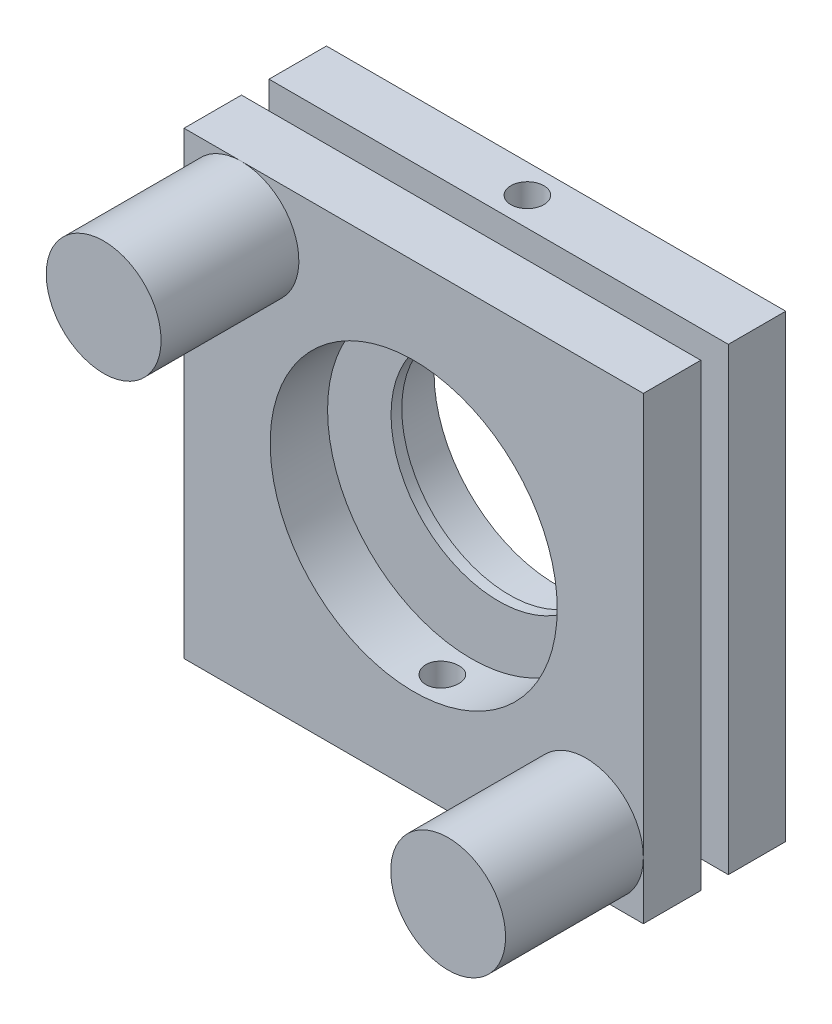
ISO-10303-21;
HEADER;
FILE_DESCRIPTION(('STEP AP214'),'2;1');
FILE_NAME('part.step','',(''),(''),'','','');
FILE_SCHEMA(('AUTOMOTIVE_DESIGN { 1 0 10303 214 1 1 1 1 }'));
ENDSEC;
DATA;
#1=APPLICATION_CONTEXT('core data for automotive mechanical design processes');
#2=APPLICATION_PROTOCOL_DEFINITION('international standard','automotive_design',2000,#1);
#3=PRODUCT_CONTEXT('',#1,'mechanical');
#4=PRODUCT('Part','Part','',(#3));
#5=PRODUCT_RELATED_PRODUCT_CATEGORY('part','',(#4));
#6=PRODUCT_DEFINITION_FORMATION('','',#4);
#7=PRODUCT_DEFINITION_CONTEXT('part definition',#1,'design');
#8=PRODUCT_DEFINITION('design','',#6,#7);
#9=PRODUCT_DEFINITION_SHAPE('','',#8);
#10=(LENGTH_UNIT() NAMED_UNIT(*) SI_UNIT(.MILLI.,.METRE.));
#11=(NAMED_UNIT(*) PLANE_ANGLE_UNIT() SI_UNIT($,.RADIAN.));
#12=(NAMED_UNIT(*) SI_UNIT($,.STERADIAN.) SOLID_ANGLE_UNIT());
#13=UNCERTAINTY_MEASURE_WITH_UNIT(LENGTH_MEASURE(1.E-05),#10,'distance_accuracy_value','');
#14=(GEOMETRIC_REPRESENTATION_CONTEXT(3) GLOBAL_UNCERTAINTY_ASSIGNED_CONTEXT((#13)) GLOBAL_UNIT_ASSIGNED_CONTEXT((#10,
#11,#12)) REPRESENTATION_CONTEXT('',''));
#15=CARTESIAN_POINT('',(0.,0.,0.));
#16=DIRECTION('',(0.,0.,1.));
#17=DIRECTION('',(1.,0.,0.));
#18=AXIS2_PLACEMENT_3D('',#15,#16,#17);
#19=CARTESIAN_POINT('',(0.,0.,6.35));
#20=DIRECTION('',(0.,0.,-1.));
#21=DIRECTION('',(-1.,0.,0.));
#22=AXIS2_PLACEMENT_3D('',#19,#20,#21);
#23=CYLINDRICAL_SURFACE('',#22,13.49375);
#24=CARTESIAN_POINT('',(0.,13.49375,4.99999));
#25=CARTESIAN_POINT('',(-0.102011065507764,13.4937484846847,4.99998571218308));
#26=CARTESIAN_POINT('',(-0.204084113140182,13.4925810328227,4.99140801103553));
#27=CARTESIAN_POINT('',(-0.405384911573508,13.4880361545994,4.95732809212892));
#28=CARTESIAN_POINT('',(-0.504609662072834,13.484656481134,4.93180866512879));
#29=CARTESIAN_POINT('',(-0.697270876109854,13.4760675340568,4.86461515998974));
#30=CARTESIAN_POINT('',(-0.790711368965015,13.4708595513084,4.82295247752227));
#31=CARTESIAN_POINT('',(-0.96925816473315,13.4591917573516,4.72468121637832));
#32=CARTESIAN_POINT('',(-1.05436578800917,13.4527321449517,4.66807501080982));
#33=CARTESIAN_POINT('',(-1.21439232934226,13.4392349304838,4.54113658284531));
#34=CARTESIAN_POINT('',(-1.28925017404579,13.4321942332398,4.47072768871401));
#35=CARTESIAN_POINT('',(-1.42612584943936,13.4183530481804,4.31834735144996));
#36=CARTESIAN_POINT('',(-1.48814299433216,13.4115525732108,4.2363752911435));
#37=CARTESIAN_POINT('',(-1.59780850199699,13.3989315654814,4.06279312652254));
#38=CARTESIAN_POINT('',(-1.64539888738692,13.3931150272035,3.97114607781443));
#39=CARTESIAN_POINT('',(-1.72448961367921,13.3831619312084,3.78106841750666));
#40=CARTESIAN_POINT('',(-1.75599066732376,13.3790252990747,3.68263810661838));
#41=CARTESIAN_POINT('',(-1.80182127116027,13.3729303380833,3.48242545379069));
#42=CARTESIAN_POINT('',(-1.81625455226167,13.370958855613,3.38066726439299));
#43=CARTESIAN_POINT('',(-1.82786102760656,13.3693773037304,3.17615546416737));
#44=CARTESIAN_POINT('',(-1.82503503070175,13.3697671236563,3.07340190021275));
#45=CARTESIAN_POINT('',(-1.80228817044596,13.3728520955904,2.87054286542589));
#46=CARTESIAN_POINT('',(-1.78248205901727,13.3755317723102,2.77042425834251));
#47=CARTESIAN_POINT('',(-1.72651646329715,13.3828703779794,2.5749447791491));
#48=CARTESIAN_POINT('',(-1.69035659628326,13.3875293532497,2.47958401844363));
#49=CARTESIAN_POINT('',(-1.60258815180315,13.3983189829991,2.29597354170509));
#50=CARTESIAN_POINT('',(-1.5509301991783,13.4044543284747,2.20774771463016));
#51=CARTESIAN_POINT('',(-1.43366722125478,13.4175018733881,2.04117345808384));
#52=CARTESIAN_POINT('',(-1.36806144995115,13.4244141143691,1.96282555729471));
#53=CARTESIAN_POINT('',(-1.2241315365846,13.4383052548934,1.81756548576252));
#54=CARTESIAN_POINT('',(-1.14570857974915,13.4452842404681,1.75075119425005));
#55=CARTESIAN_POINT('',(-0.978709321728446,13.4584702342152,1.63121872162295));
#56=CARTESIAN_POINT('',(-0.890132989801093,13.4646772400501,1.57850058318986));
#57=CARTESIAN_POINT('',(-0.705262224236707,13.475624732159,1.48865490134986));
#58=CARTESIAN_POINT('',(-0.608964504311511,13.4803645897862,1.45153403866925));
#59=CARTESIAN_POINT('',(-0.411424068830881,13.4878382315402,1.39401719435643));
#60=CARTESIAN_POINT('',(-0.310181624900939,13.4905721257274,1.37362029512942));
#61=CARTESIAN_POINT('',(-0.106471348205664,13.4937113965345,1.35025850740771));
#62=CARTESIAN_POINT('',(-0.00401923285335998,13.49413476909,1.34715889145906));
#63=CARTESIAN_POINT('',(0.199943102233538,13.4926540374248,1.35812330906334));
#64=CARTESIAN_POINT('',(0.301453345475255,13.4907499914498,1.37218691309155));
#65=CARTESIAN_POINT('',(0.500248793521115,13.4848395299594,1.41696658219215));
#66=CARTESIAN_POINT('',(0.597548855277587,13.4808412953621,1.44761786310707));
#67=CARTESIAN_POINT('',(0.785628222473928,13.4711897491495,1.52463508122611));
#68=CARTESIAN_POINT('',(0.876407272517,13.4655363727542,1.57100163351589));
#69=CARTESIAN_POINT('',(1.04946584897577,13.4531591632773,1.67845533484081));
#70=CARTESIAN_POINT('',(1.1316912169174,13.446429122137,1.73962898060639));
#71=CARTESIAN_POINT('',(1.28475602893671,13.4326694297858,1.87483876615841));
#72=CARTESIAN_POINT('',(1.35559494020665,13.425639764574,1.94887550751198));
#73=CARTESIAN_POINT('',(1.48435876334851,13.4120169803227,2.10830583010283));
#74=CARTESIAN_POINT('',(1.5421939680749,13.405427101834,2.19377218119314));
#75=CARTESIAN_POINT('',(1.64268744308819,13.3934849405941,2.37328519570781));
#76=CARTESIAN_POINT('',(1.68534606035804,13.3881326295493,2.46733166290284));
#77=CARTESIAN_POINT('',(1.75413259612252,13.3792942692336,2.66105437573903));
#78=CARTESIAN_POINT('',(1.78030977904879,13.3758026630075,2.76071286421206));
#79=CARTESIAN_POINT('',(1.81554834912333,13.3710655759946,2.96306167910378));
#80=CARTESIAN_POINT('',(1.82461068045636,13.3698199713016,3.06575183795512));
#81=CARTESIAN_POINT('',(1.82534297587301,13.3697199382207,3.27035594220333));
#82=CARTESIAN_POINT('',(1.8171539083415,13.3708461288808,3.37226940202946));
#83=CARTESIAN_POINT('',(1.78391576732261,13.3753209508971,3.57325657676135));
#84=CARTESIAN_POINT('',(1.75886670221735,13.3786695811484,3.67233029307888));
#85=CARTESIAN_POINT('',(1.69266598510481,13.3872056776009,3.86479906401303));
#86=CARTESIAN_POINT('',(1.65152232627812,13.3923922309002,3.95819691091883));
#87=CARTESIAN_POINT('',(1.55431419904779,13.4040211193476,4.13678623321956));
#88=CARTESIAN_POINT('',(1.49824941859329,13.4104634807581,4.2219775369373));
#89=CARTESIAN_POINT('',(1.37227154711501,13.4239410347823,4.38245454663529));
#90=CARTESIAN_POINT('',(1.30225360339792,13.4309804688922,4.45765759210414));
#91=CARTESIAN_POINT('',(1.1505774674404,13.4448223280904,4.59529888892537));
#92=CARTESIAN_POINT('',(1.06891655144899,13.4516246972552,4.65773414504438));
#93=CARTESIAN_POINT('',(0.895851056310109,13.4642599174439,4.76830917136205));
#94=CARTESIAN_POINT('',(0.804404773573208,13.47008832382,4.81638415388145));
#95=CARTESIAN_POINT('',(0.61470549441652,13.4800746140666,4.89642420871696));
#96=CARTESIAN_POINT('',(0.516459888431812,13.4842342793282,4.92840646943554));
#97=CARTESIAN_POINT('',(0.348109339331014,13.4894321908733,4.96785187211876));
#98=CARTESIAN_POINT('',(0.279057854872004,13.491043316646,4.97988592932566));
#99=CARTESIAN_POINT('',(0.140013975697671,13.4932027363939,4.99595642814456));
#100=CARTESIAN_POINT('',(0.0700215896297378,13.4937510401301,4.99999294320773));
#101=CARTESIAN_POINT('',(0.,13.49375,4.99999));
#102=B_SPLINE_CURVE_WITH_KNOTS('',3,(#24,#25,#26,#27,#28,#29,#30,#31,#32,#33,#34,#35,#36,#37,
#38,#39,#40,#41,#42,#43,#44,#45,#46,#47,#48,#49,#50,#51,#52,#53,#54,#55,#56,#57,#58,#59,#60,#61,
#62,#63,#64,#65,#66,#67,#68,#69,#70,#71,#72,#73,#74,#75,#76,#77,#78,#79,#80,#81,#82,#83,#84,#85,
#86,#87,#88,#89,#90,#91,#92,#93,#94,#95,#96,#97,#98,#99,#100,#101),.UNSPECIFIED.,.T.,.F.,(4,2,2,
2,2,2,2,2,2,2,2,2,2,2,2,2,2,2,2,2,2,2,2,2,2,2,2,2,2,2,2,2,2,2,2,2,2,2,4),(0.,0.305777392014365,
0.611865865971447,0.917738661768646,1.22356291258956,1.53113673496319,1.83872698003231,
2.14753744500254,2.45633422877429,2.76324446610899,3.07014032028347,3.37497836978815,
3.67982355370333,3.98565044391131,4.29149369551661,4.59981691115257,4.90814106034543,
5.21659713864297,5.52503629172792,5.8310696425318,6.13709533473841,6.44193436132278,
6.74678532048974,7.05346199240147,7.3601530104937,7.6688989334211,7.97763779702386,
8.28544937669571,8.59324397465485,8.89853321415223,9.20382230187207,9.50895996364861,
9.81410400738187,10.121633981145,10.429236016718,10.7382055638717,11.0468444008936,
11.2567355102678,11.4666246919473),.UNSPECIFIED.);
#103=CARTESIAN_POINT('',(0.,13.49375,4.99999));
#104=VERTEX_POINT('',#103);
#105=EDGE_CURVE('E236',#104,#104,#102,.T.);
#106=ORIENTED_EDGE('',*,*,#105,.F.);
#107=EDGE_LOOP('',(#106));
#108=FACE_BOUND('',#107,.T.);
#109=CARTESIAN_POINT('',(0.,0.,0.));
#110=DIRECTION('',(0.,0.,1.));
#111=DIRECTION('',(1.,0.,0.));
#112=AXIS2_PLACEMENT_3D('',#109,#110,#111);
#113=CIRCLE('',#112,13.49375);
#114=CARTESIAN_POINT('',(13.49375,0.,0.));
#115=VERTEX_POINT('',#114);
#116=EDGE_CURVE('E270',#115,#115,#113,.T.);
#117=ORIENTED_EDGE('',*,*,#116,.F.);
#118=EDGE_LOOP('',(#117));
#119=FACE_BOUND('',#118,.T.);
#120=CARTESIAN_POINT('',(0.,0.,5.159375));
#121=DIRECTION('',(0.,0.,1.));
#122=DIRECTION('',(1.,0.,0.));
#123=AXIS2_PLACEMENT_3D('',#120,#121,#122);
#124=CIRCLE('',#123,13.49375);
#125=CARTESIAN_POINT('',(13.49375,0.,5.159375));
#126=VERTEX_POINT('',#125);
#127=EDGE_CURVE('E49',#126,#126,#124,.T.);
#128=ORIENTED_EDGE('',*,*,#127,.T.);
#129=EDGE_LOOP('',(#128));
#130=FACE_BOUND('',#129,.T.);
#131=ADVANCED_FACE('F45',(#108,#119,#130),#23,.F.);
#132=CARTESIAN_POINT('',(0.,0.,6.35));
#133=DIRECTION('',(0.,0.,-1.));
#134=DIRECTION('',(-1.,0.,0.));
#135=AXIS2_PLACEMENT_3D('',#132,#133,#134);
#136=PLANE('',#135);
#137=CARTESIAN_POINT('',(-19.05,19.05,6.35));
#138=DIRECTION('',(0.,0.,-1.));
#139=DIRECTION('',(-1.,0.,0.));
#140=AXIS2_PLACEMENT_3D('',#137,#138,#139);
#141=CIRCLE('',#140,3.175);
#142=CARTESIAN_POINT('',(-22.225,19.05,6.35));
#143=VERTEX_POINT('',#142);
#144=EDGE_CURVE('E11',#143,#143,#141,.F.);
#145=ORIENTED_EDGE('',*,*,#144,.F.);
#146=EDGE_LOOP('',(#145));
#147=FACE_BOUND('',#146,.T.);
#148=CARTESIAN_POINT('',(19.05,-19.05,6.35));
#149=DIRECTION('',(0.,0.,-1.));
#150=DIRECTION('',(-1.,0.,0.));
#151=AXIS2_PLACEMENT_3D('',#148,#149,#150);
#152=CIRCLE('',#151,3.175);
#153=CARTESIAN_POINT('',(15.875,-19.05,6.35));
#154=VERTEX_POINT('',#153);
#155=EDGE_CURVE('E55',#154,#154,#152,.F.);
#156=ORIENTED_EDGE('',*,*,#155,.F.);
#157=EDGE_LOOP('',(#156));
#158=FACE_BOUND('',#157,.T.);
#159=DIRECTION('',(0.,1.,0.));
#160=VECTOR('',#159,1.);
#161=CARTESIAN_POINT('',(25.4,-25.4,6.35));
#162=LINE('',#161,#160);
#163=CARTESIAN_POINT('',(25.4,-25.4,6.35));
#164=VERTEX_POINT('',#163);
#165=CARTESIAN_POINT('',(25.4,25.4,6.35));
#166=VERTEX_POINT('',#165);
#167=EDGE_CURVE('E274',#164,#166,#162,.T.);
#168=ORIENTED_EDGE('',*,*,#167,.T.);
#169=DIRECTION('',(-1.,0.,0.));
#170=VECTOR('',#169,1.);
#171=CARTESIAN_POINT('',(-25.4,25.4,6.35));
#172=LINE('',#171,#170);
#173=CARTESIAN_POINT('',(-25.4,25.4,6.35));
#174=VERTEX_POINT('',#173);
#175=EDGE_CURVE('E94',#166,#174,#172,.T.);
#176=ORIENTED_EDGE('',*,*,#175,.T.);
#177=DIRECTION('',(0.,-1.,0.));
#178=VECTOR('',#177,1.);
#179=CARTESIAN_POINT('',(-25.4,-25.4,6.35));
#180=LINE('',#179,#178);
#181=CARTESIAN_POINT('',(-25.4,-25.4,6.35));
#182=VERTEX_POINT('',#181);
#183=EDGE_CURVE('E278',#174,#182,#180,.T.);
#184=ORIENTED_EDGE('',*,*,#183,.T.);
#185=DIRECTION('',(1.,0.,0.));
#186=VECTOR('',#185,1.);
#187=CARTESIAN_POINT('',(-25.4,-25.4,6.35));
#188=LINE('',#187,#186);
#189=EDGE_CURVE('E64',#182,#164,#188,.T.);
#190=ORIENTED_EDGE('',*,*,#189,.T.);
#191=EDGE_LOOP('',(#168,#176,#184,#190));
#192=FACE_BOUND('',#191,.T.);
#193=CARTESIAN_POINT('',(0.,0.,6.35));
#194=DIRECTION('',(0.,0.,1.));
#195=DIRECTION('',(1.,0.,0.));
#196=AXIS2_PLACEMENT_3D('',#193,#194,#195);
#197=CIRCLE('',#196,11.90625);
#198=CARTESIAN_POINT('',(11.90625,0.,6.35));
#199=VERTEX_POINT('',#198);
#200=EDGE_CURVE('E244',#199,#199,#197,.T.);
#201=ORIENTED_EDGE('',*,*,#200,.F.);
#202=EDGE_LOOP('',(#201));
#203=FACE_BOUND('',#202,.T.);
#204=ADVANCED_FACE('F217',(#147,#158,#192,#203),#136,.F.);
#205=CARTESIAN_POINT('',(0.,0.,0.));
#206=DIRECTION('',(0.,0.,-1.));
#207=DIRECTION('',(-1.,0.,0.));
#208=AXIS2_PLACEMENT_3D('',#205,#206,#207);
#209=PLANE('',#208);
#210=DIRECTION('',(0.,1.,0.));
#211=VECTOR('',#210,1.);
#212=CARTESIAN_POINT('',(25.4,-25.4,0.));
#213=LINE('',#212,#211);
#214=CARTESIAN_POINT('',(25.4,-25.4,0.));
#215=VERTEX_POINT('',#214);
#216=CARTESIAN_POINT('',(25.4,25.4,0.));
#217=VERTEX_POINT('',#216);
#218=EDGE_CURVE('E273',#215,#217,#213,.T.);
#219=ORIENTED_EDGE('',*,*,#218,.F.);
#220=DIRECTION('',(1.,0.,0.));
#221=VECTOR('',#220,1.);
#222=CARTESIAN_POINT('',(-25.4,-25.4,0.));
#223=LINE('',#222,#221);
#224=CARTESIAN_POINT('',(-25.4,-25.4,0.));
#225=VERTEX_POINT('',#224);
#226=EDGE_CURVE('E276',#225,#215,#223,.T.);
#227=ORIENTED_EDGE('',*,*,#226,.F.);
#228=DIRECTION('',(0.,-1.,0.));
#229=VECTOR('',#228,1.);
#230=CARTESIAN_POINT('',(-25.4,-25.4,0.));
#231=LINE('',#230,#229);
#232=CARTESIAN_POINT('',(-25.4,25.4,0.));
#233=VERTEX_POINT('',#232);
#234=EDGE_CURVE('E285',#233,#225,#231,.T.);
#235=ORIENTED_EDGE('',*,*,#234,.F.);
#236=DIRECTION('',(-1.,0.,0.));
#237=VECTOR('',#236,1.);
#238=CARTESIAN_POINT('',(-25.4,25.4,0.));
#239=LINE('',#238,#237);
#240=EDGE_CURVE('E282',#217,#233,#239,.T.);
#241=ORIENTED_EDGE('',*,*,#240,.F.);
#242=EDGE_LOOP('',(#219,#227,#235,#241));
#243=FACE_BOUND('',#242,.T.);
#244=ORIENTED_EDGE('',*,*,#116,.T.);
#245=EDGE_LOOP('',(#244));
#246=FACE_BOUND('',#245,.T.);
#247=ADVANCED_FACE('F225',(#243,#246),#209,.T.);
#248=CARTESIAN_POINT('',(25.4,-25.4,6.35));
#249=DIRECTION('',(-1.,0.,0.));
#250=DIRECTION('',(0.,0.,1.));
#251=AXIS2_PLACEMENT_3D('',#248,#249,#250);
#252=PLANE('',#251);
#253=DIRECTION('',(0.,0.,-1.));
#254=VECTOR('',#253,1.);
#255=CARTESIAN_POINT('',(25.4,-25.4,6.35));
#256=LINE('',#255,#254);
#257=EDGE_CURVE('E88',#164,#215,#256,.T.);
#258=ORIENTED_EDGE('',*,*,#257,.T.);
#259=ORIENTED_EDGE('',*,*,#218,.T.);
#260=DIRECTION('',(0.,0.,-1.));
#261=VECTOR('',#260,1.);
#262=CARTESIAN_POINT('',(25.4,25.4,6.35));
#263=LINE('',#262,#261);
#264=EDGE_CURVE('E291',#166,#217,#263,.T.);
#265=ORIENTED_EDGE('',*,*,#264,.F.);
#266=ORIENTED_EDGE('',*,*,#167,.F.);
#267=EDGE_LOOP('',(#258,#259,#265,#266));
#268=FACE_BOUND('',#267,.T.);
#269=ADVANCED_FACE('F47',(#268),#252,.F.);
#270=CARTESIAN_POINT('',(-25.4,25.4,6.35));
#271=DIRECTION('',(0.,-1.,0.));
#272=DIRECTION('',(0.,0.,-1.));
#273=AXIS2_PLACEMENT_3D('',#270,#271,#272);
#274=PLANE('',#273);
#275=CARTESIAN_POINT('',(0.,25.4,3.175));
#276=DIRECTION('',(0.,1.,0.));
#277=DIRECTION('',(0.,0.,1.));
#278=AXIS2_PLACEMENT_3D('',#275,#276,#277);
#279=CIRCLE('',#278,1.82499);
#280=CARTESIAN_POINT('',(0.,25.4,4.99999));
#281=VERTEX_POINT('',#280);
#282=EDGE_CURVE('E245',#281,#281,#279,.T.);
#283=ORIENTED_EDGE('',*,*,#282,.F.);
#284=EDGE_LOOP('',(#283));
#285=FACE_BOUND('',#284,.T.);
#286=ORIENTED_EDGE('',*,*,#264,.T.);
#287=ORIENTED_EDGE('',*,*,#240,.T.);
#288=DIRECTION('',(0.,0.,-1.));
#289=VECTOR('',#288,1.);
#290=CARTESIAN_POINT('',(-25.4,25.4,6.35));
#291=LINE('',#290,#289);
#292=EDGE_CURVE('E290',#174,#233,#291,.T.);
#293=ORIENTED_EDGE('',*,*,#292,.F.);
#294=ORIENTED_EDGE('',*,*,#175,.F.);
#295=EDGE_LOOP('',(#286,#287,#293,#294));
#296=FACE_BOUND('',#295,.T.);
#297=ADVANCED_FACE('F441',(#285,#296),#274,.F.);
#298=CARTESIAN_POINT('',(-25.4,-25.4,6.35));
#299=DIRECTION('',(1.,0.,0.));
#300=DIRECTION('',(0.,0.,-1.));
#301=AXIS2_PLACEMENT_3D('',#298,#299,#300);
#302=PLANE('',#301);
#303=ORIENTED_EDGE('',*,*,#292,.T.);
#304=ORIENTED_EDGE('',*,*,#234,.T.);
#305=DIRECTION('',(0.,0.,-1.));
#306=VECTOR('',#305,1.);
#307=CARTESIAN_POINT('',(-25.4,-25.4,6.35));
#308=LINE('',#307,#306);
#309=EDGE_CURVE('E81',#182,#225,#308,.T.);
#310=ORIENTED_EDGE('',*,*,#309,.F.);
#311=ORIENTED_EDGE('',*,*,#183,.F.);
#312=EDGE_LOOP('',(#303,#304,#310,#311));
#313=FACE_BOUND('',#312,.T.);
#314=ADVANCED_FACE('F444',(#313),#302,.F.);
#315=CARTESIAN_POINT('',(-25.4,-25.4,6.35));
#316=DIRECTION('',(0.,1.,0.));
#317=DIRECTION('',(0.,0.,1.));
#318=AXIS2_PLACEMENT_3D('',#315,#316,#317);
#319=PLANE('',#318);
#320=ORIENTED_EDGE('',*,*,#309,.T.);
#321=ORIENTED_EDGE('',*,*,#226,.T.);
#322=ORIENTED_EDGE('',*,*,#257,.F.);
#323=ORIENTED_EDGE('',*,*,#189,.F.);
#324=EDGE_LOOP('',(#320,#321,#322,#323));
#325=FACE_BOUND('',#324,.T.);
#326=ADVANCED_FACE('F261',(#325),#319,.F.);
#327=CARTESIAN_POINT('',(0.,0.,5.159375));
#328=DIRECTION('',(0.,0.,1.));
#329=DIRECTION('',(1.,0.,0.));
#330=AXIS2_PLACEMENT_3D('',#327,#328,#329);
#331=PLANE('',#330);
#332=CARTESIAN_POINT('',(0.,0.,5.159375));
#333=DIRECTION('',(0.,0.,1.));
#334=DIRECTION('',(1.,0.,0.));
#335=AXIS2_PLACEMENT_3D('',#332,#333,#334);
#336=CIRCLE('',#335,11.90625);
#337=CARTESIAN_POINT('',(11.90625,0.,5.159375));
#338=VERTEX_POINT('',#337);
#339=EDGE_CURVE('E247',#338,#338,#336,.T.);
#340=ORIENTED_EDGE('',*,*,#339,.T.);
#341=EDGE_LOOP('',(#340));
#342=FACE_BOUND('',#341,.T.);
#343=ORIENTED_EDGE('',*,*,#127,.F.);
#344=EDGE_LOOP('',(#343));
#345=FACE_BOUND('',#344,.T.);
#346=ADVANCED_FACE('F232',(#342,#345),#331,.F.);
#347=CARTESIAN_POINT('',(0.,0.,5.159375));
#348=DIRECTION('',(0.,0.,1.));
#349=DIRECTION('',(1.,0.,0.));
#350=AXIS2_PLACEMENT_3D('',#347,#348,#349);
#351=CYLINDRICAL_SURFACE('',#350,11.90625);
#352=CARTESIAN_POINT('',(11.90625,0.,5.159375));
#353=CARTESIAN_POINT('',(11.90625,0.,5.17177734375));
#354=CARTESIAN_POINT('',(11.90625,0.,5.1841796875));
#355=CARTESIAN_POINT('',(11.90625,0.,5.208984375));
#356=CARTESIAN_POINT('',(11.90625,0.,5.22138671875));
#357=CARTESIAN_POINT('',(11.90625,0.,5.24619140625));
#358=CARTESIAN_POINT('',(11.90625,0.,5.25859375));
#359=CARTESIAN_POINT('',(11.90625,0.,5.2833984375));
#360=CARTESIAN_POINT('',(11.90625,0.,5.29580078125));
#361=CARTESIAN_POINT('',(11.90625,0.,5.32060546875));
#362=CARTESIAN_POINT('',(11.90625,0.,5.3330078125));
#363=CARTESIAN_POINT('',(11.90625,0.,5.3578125));
#364=CARTESIAN_POINT('',(11.90625,0.,5.37021484375));
#365=CARTESIAN_POINT('',(11.90625,0.,5.39501953125));
#366=CARTESIAN_POINT('',(11.90625,0.,5.407421875));
#367=CARTESIAN_POINT('',(11.90625,0.,5.4322265625));
#368=CARTESIAN_POINT('',(11.90625,0.,5.44462890625));
#369=CARTESIAN_POINT('',(11.90625,0.,5.46943359375));
#370=CARTESIAN_POINT('',(11.90625,0.,5.4818359375));
#371=CARTESIAN_POINT('',(11.90625,0.,5.506640625));
#372=CARTESIAN_POINT('',(11.90625,0.,5.51904296875));
#373=CARTESIAN_POINT('',(11.90625,0.,5.54384765625));
#374=CARTESIAN_POINT('',(11.90625,0.,5.55625));
#375=CARTESIAN_POINT('',(11.90625,0.,5.5810546875));
#376=CARTESIAN_POINT('',(11.90625,0.,5.59345703125));
#377=CARTESIAN_POINT('',(11.90625,0.,5.61826171875));
#378=CARTESIAN_POINT('',(11.90625,0.,5.6306640625));
#379=CARTESIAN_POINT('',(11.90625,0.,5.65546875));
#380=CARTESIAN_POINT('',(11.90625,0.,5.66787109375));
#381=CARTESIAN_POINT('',(11.90625,0.,5.69267578125));
#382=CARTESIAN_POINT('',(11.90625,0.,5.705078125));
#383=CARTESIAN_POINT('',(11.90625,0.,5.7298828125));
#384=CARTESIAN_POINT('',(11.90625,0.,5.74228515625));
#385=CARTESIAN_POINT('',(11.90625,0.,5.76708984375));
#386=CARTESIAN_POINT('',(11.90625,0.,5.7794921875));
#387=CARTESIAN_POINT('',(11.90625,0.,5.804296875));
#388=CARTESIAN_POINT('',(11.90625,0.,5.81669921875));
#389=CARTESIAN_POINT('',(11.90625,0.,5.84150390625));
#390=CARTESIAN_POINT('',(11.90625,0.,5.85390625));
#391=CARTESIAN_POINT('',(11.90625,0.,5.8787109375));
#392=CARTESIAN_POINT('',(11.90625,0.,5.89111328125));
#393=CARTESIAN_POINT('',(11.90625,0.,5.91591796875));
#394=CARTESIAN_POINT('',(11.90625,0.,5.9283203125));
#395=CARTESIAN_POINT('',(11.90625,0.,5.953125));
#396=CARTESIAN_POINT('',(11.90625,0.,5.96552734375));
#397=CARTESIAN_POINT('',(11.90625,0.,5.99033203125));
#398=CARTESIAN_POINT('',(11.90625,0.,6.002734375));
#399=CARTESIAN_POINT('',(11.90625,0.,6.0275390625));
#400=CARTESIAN_POINT('',(11.90625,0.,6.03994140625));
#401=CARTESIAN_POINT('',(11.90625,0.,6.06474609375));
#402=CARTESIAN_POINT('',(11.90625,0.,6.0771484375));
#403=CARTESIAN_POINT('',(11.90625,0.,6.101953125));
#404=CARTESIAN_POINT('',(11.90625,0.,6.11435546875));
#405=CARTESIAN_POINT('',(11.90625,0.,6.13916015625));
#406=CARTESIAN_POINT('',(11.90625,0.,6.1515625));
#407=CARTESIAN_POINT('',(11.90625,0.,6.1763671875));
#408=CARTESIAN_POINT('',(11.90625,0.,6.18876953125));
#409=CARTESIAN_POINT('',(11.90625,0.,6.21357421875));
#410=CARTESIAN_POINT('',(11.90625,0.,6.2259765625));
#411=CARTESIAN_POINT('',(11.90625,0.,6.25078125));
#412=CARTESIAN_POINT('',(11.90625,0.,6.26318359375));
#413=CARTESIAN_POINT('',(11.90625,0.,6.28798828125));
#414=CARTESIAN_POINT('',(11.90625,0.,6.300390625));
#415=CARTESIAN_POINT('',(11.90625,0.,6.3251953125));
#416=CARTESIAN_POINT('',(11.90625,0.,6.33759765625));
#417=CARTESIAN_POINT('',(11.90625,0.,6.35));
#418=B_SPLINE_CURVE_WITH_KNOTS('',3,(#352,#353,#354,#355,#356,#357,#358,#359,#360,#361,#362,
#363,#364,#365,#366,#367,#368,#369,#370,#371,#372,#373,#374,#375,#376,#377,#378,#379,#380,#381,
#382,#383,#384,#385,#386,#387,#388,#389,#390,#391,#392,#393,#394,#395,#396,#397,#398,#399,#400,
#401,#402,#403,#404,#405,#406,#407,#408,#409,#410,#411,#412,#413,#414,#415,#416,#417),
.UNSPECIFIED.,.F.,.F.,(4,2,2,2,2,2,2,2,2,2,2,2,2,2,2,2,2,2,2,2,2,2,2,2,2,2,2,2,2,2,2,2,4),(0.,
0.03720703125,0.0744140625,0.11162109375,0.148828125,0.18603515625,0.2232421875,0.26044921875,
0.29765625,0.33486328125,0.3720703125,0.40927734375,0.446484375,0.48369140625,0.5208984375,
0.55810546875,0.5953125,0.63251953125,0.6697265625,0.70693359375,0.744140625,0.78134765625,
0.8185546875,0.855761718750001,0.892968750000001,0.930175781250001,0.967382812500001,
1.00458984375,1.041796875,1.07900390625,1.1162109375,1.15341796875,1.190625),.UNSPECIFIED.);
#419=EDGE_CURVE('BSEAM254',#338,#199,#418,.T.);
#420=ORIENTED_EDGE('',*,*,#339,.F.);
#421=ORIENTED_EDGE('',*,*,#200,.T.);
#422=ORIENTED_EDGE('',*,*,#419,.T.);
#423=ORIENTED_EDGE('',*,*,#419,.F.);
#424=EDGE_LOOP('',(#420,#422,#421,#423));
#425=FACE_BOUND('',#424,.T.);
#426=ADVANCED_FACE('F254',(#425),#351,.F.);
#427=CARTESIAN_POINT('',(0.,6.35,3.175));
#428=DIRECTION('',(0.,1.,0.));
#429=DIRECTION('',(0.,0.,1.));
#430=AXIS2_PLACEMENT_3D('',#427,#428,#429);
#431=CYLINDRICAL_SURFACE('',#430,1.82499);
#432=ORIENTED_EDGE('',*,*,#105,.T.);
#433=EDGE_LOOP('',(#432));
#434=FACE_BOUND('',#433,.T.);
#435=ORIENTED_EDGE('',*,*,#282,.T.);
#436=EDGE_LOOP('',(#435));
#437=FACE_BOUND('',#436,.T.);
#438=ADVANCED_FACE('F249',(#434,#437),#431,.F.);
#439=CARTESIAN_POINT('',(19.05,-19.05,-8.98025612106915));
#440=DIRECTION('',(0.,0.,1.));
#441=DIRECTION('',(1.,0.,0.));
#442=AXIS2_PLACEMENT_3D('',#439,#440,#441);
#443=CYLINDRICAL_SURFACE('',#442,3.175);
#444=CARTESIAN_POINT('',(19.05,-19.05,9.398));
#445=DIRECTION('',(0.,0.,-1.));
#446=DIRECTION('',(-1.,0.,0.));
#447=AXIS2_PLACEMENT_3D('',#444,#445,#446);
#448=CIRCLE('',#447,3.175);
#449=CARTESIAN_POINT('',(15.875,-19.05,9.398));
#450=VERTEX_POINT('',#449);
#451=EDGE_CURVE('E298',#450,#450,#448,.T.);
#452=ORIENTED_EDGE('',*,*,#451,.T.);
#453=EDGE_LOOP('',(#452));
#454=FACE_BOUND('',#453,.T.);
#455=ORIENTED_EDGE('',*,*,#155,.T.);
#456=EDGE_LOOP('',(#455));
#457=FACE_BOUND('',#456,.T.);
#458=ADVANCED_FACE('F253',(#454,#457),#443,.T.);
#459=CARTESIAN_POINT('',(0.,0.,15.748));
#460=DIRECTION('',(0.,0.,-1.));
#461=DIRECTION('',(-1.,0.,0.));
#462=AXIS2_PLACEMENT_3D('',#459,#460,#461);
#463=PLANE('',#462);
#464=CARTESIAN_POINT('',(-19.05,19.05,15.748));
#465=DIRECTION('',(0.,0.,1.));
#466=DIRECTION('',(1.,0.,0.));
#467=AXIS2_PLACEMENT_3D('',#464,#465,#466);
#468=CIRCLE('',#467,6.35);
#469=CARTESIAN_POINT('',(-25.4,19.05,15.748));
#470=VERTEX_POINT('',#469);
#471=CARTESIAN_POINT('',(-19.05,25.4,15.748));
#472=VERTEX_POINT('',#471);
#473=EDGE_CURVE('E156',#470,#472,#468,.T.);
#474=ORIENTED_EDGE('',*,*,#473,.F.);
#475=DIRECTION('',(0.,-1.,0.));
#476=VECTOR('',#475,1.);
#477=CARTESIAN_POINT('',(-25.4,-25.4,15.748));
#478=LINE('',#477,#476);
#479=CARTESIAN_POINT('',(-25.4,-25.4,15.748));
#480=VERTEX_POINT('',#479);
#481=EDGE_CURVE('E143',#470,#480,#478,.T.);
#482=ORIENTED_EDGE('',*,*,#481,.T.);
#483=DIRECTION('',(1.,0.,0.));
#484=VECTOR('',#483,1.);
#485=CARTESIAN_POINT('',(-25.4,-25.4,15.748));
#486=LINE('',#485,#484);
#487=CARTESIAN_POINT('',(19.05,-25.4,15.748));
#488=VERTEX_POINT('',#487);
#489=EDGE_CURVE('E310',#480,#488,#486,.T.);
#490=ORIENTED_EDGE('',*,*,#489,.T.);
#491=CARTESIAN_POINT('',(19.05,-19.05,15.748));
#492=DIRECTION('',(0.,0.,1.));
#493=DIRECTION('',(1.,0.,0.));
#494=AXIS2_PLACEMENT_3D('',#491,#492,#493);
#495=CIRCLE('',#494,6.35);
#496=CARTESIAN_POINT('',(25.4,-19.05,15.748));
#497=VERTEX_POINT('',#496);
#498=EDGE_CURVE('E164',#497,#488,#495,.T.);
#499=ORIENTED_EDGE('',*,*,#498,.F.);
#500=DIRECTION('',(0.,1.,0.));
#501=VECTOR('',#500,1.);
#502=CARTESIAN_POINT('',(25.4,-25.4,15.748));
#503=LINE('',#502,#501);
#504=CARTESIAN_POINT('',(25.4,25.4,15.748));
#505=VERTEX_POINT('',#504);
#506=EDGE_CURVE('E313',#497,#505,#503,.T.);
#507=ORIENTED_EDGE('',*,*,#506,.T.);
#508=DIRECTION('',(-1.,0.,0.));
#509=VECTOR('',#508,1.);
#510=CARTESIAN_POINT('',(-25.4,25.4,15.748));
#511=LINE('',#510,#509);
#512=EDGE_CURVE('E153',#505,#472,#511,.T.);
#513=ORIENTED_EDGE('',*,*,#512,.T.);
#514=EDGE_LOOP('',(#474,#482,#490,#499,#507,#513));
#515=FACE_BOUND('',#514,.T.);
#516=CARTESIAN_POINT('',(0.,0.,15.748));
#517=DIRECTION('',(0.,0.,1.));
#518=DIRECTION('',(1.,0.,0.));
#519=AXIS2_PLACEMENT_3D('',#516,#517,#518);
#520=CIRCLE('',#519,15.875);
#521=CARTESIAN_POINT('',(15.875,0.,15.748));
#522=VERTEX_POINT('',#521);
#523=EDGE_CURVE('E187',#522,#522,#520,.T.);
#524=ORIENTED_EDGE('',*,*,#523,.F.);
#525=EDGE_LOOP('',(#524));
#526=FACE_BOUND('',#525,.T.);
#527=ADVANCED_FACE('F157',(#515,#526),#463,.F.);
#528=EDGE_CURVE('E136',#472,#470,#468,.T.);
#529=ORIENTED_EDGE('',*,*,#528,.F.);
#530=CARTESIAN_POINT('',(-25.4,25.4,15.748));
#531=VERTEX_POINT('',#530);
#532=EDGE_CURVE('E138',#472,#531,#511,.T.);
#533=ORIENTED_EDGE('',*,*,#532,.T.);
#534=EDGE_CURVE('E132',#531,#470,#478,.T.);
#535=ORIENTED_EDGE('',*,*,#534,.T.);
#536=EDGE_LOOP('',(#529,#533,#535));
#537=FACE_BOUND('',#536,.T.);
#538=ADVANCED_FACE('F134',(#537),#463,.F.);
#539=EDGE_CURVE('E168',#488,#497,#495,.T.);
#540=ORIENTED_EDGE('',*,*,#539,.F.);
#541=CARTESIAN_POINT('',(25.4,-25.4,15.748));
#542=VERTEX_POINT('',#541);
#543=EDGE_CURVE('E142',#488,#542,#486,.T.);
#544=ORIENTED_EDGE('',*,*,#543,.T.);
#545=EDGE_CURVE('E324',#542,#497,#503,.T.);
#546=ORIENTED_EDGE('',*,*,#545,.T.);
#547=EDGE_LOOP('',(#540,#544,#546));
#548=FACE_BOUND('',#547,.T.);
#549=ADVANCED_FACE('F335',(#548),#463,.F.);
#550=CARTESIAN_POINT('',(0.,0.,9.398));
#551=DIRECTION('',(0.,0.,-1.));
#552=DIRECTION('',(-1.,0.,0.));
#553=AXIS2_PLACEMENT_3D('',#550,#551,#552);
#554=PLANE('',#553);
#555=CARTESIAN_POINT('',(-19.05,19.05,9.398));
#556=DIRECTION('',(0.,0.,-1.));
#557=DIRECTION('',(-1.,0.,0.));
#558=AXIS2_PLACEMENT_3D('',#555,#556,#557);
#559=CIRCLE('',#558,3.175);
#560=CARTESIAN_POINT('',(-22.225,19.05,9.398));
#561=VERTEX_POINT('',#560);
#562=EDGE_CURVE('E173',#561,#561,#559,.T.);
#563=ORIENTED_EDGE('',*,*,#562,.F.);
#564=EDGE_LOOP('',(#563));
#565=FACE_BOUND('',#564,.T.);
#566=ORIENTED_EDGE('',*,*,#451,.F.);
#567=EDGE_LOOP('',(#566));
#568=FACE_BOUND('',#567,.T.);
#569=CARTESIAN_POINT('',(0.,0.,9.398));
#570=DIRECTION('',(0.,0.,-1.));
#571=DIRECTION('',(-1.,0.,0.));
#572=AXIS2_PLACEMENT_3D('',#569,#570,#571);
#573=CIRCLE('',#572,15.875);
#574=CARTESIAN_POINT('',(-15.875,0.,9.398));
#575=VERTEX_POINT('',#574);
#576=EDGE_CURVE('E321',#575,#575,#573,.F.);
#577=ORIENTED_EDGE('',*,*,#576,.T.);
#578=EDGE_LOOP('',(#577));
#579=FACE_BOUND('',#578,.T.);
#580=DIRECTION('',(0.,1.,0.));
#581=VECTOR('',#580,1.);
#582=CARTESIAN_POINT('',(25.4,-25.4,9.398));
#583=LINE('',#582,#581);
#584=CARTESIAN_POINT('',(25.4,-25.4,9.398));
#585=VERTEX_POINT('',#584);
#586=CARTESIAN_POINT('',(25.4,25.4,9.398));
#587=VERTEX_POINT('',#586);
#588=EDGE_CURVE('E318',#585,#587,#583,.T.);
#589=ORIENTED_EDGE('',*,*,#588,.F.);
#590=DIRECTION('',(1.,0.,0.));
#591=VECTOR('',#590,1.);
#592=CARTESIAN_POINT('',(-25.4,-25.4,9.398));
#593=LINE('',#592,#591);
#594=CARTESIAN_POINT('',(-25.4,-25.4,9.398));
#595=VERTEX_POINT('',#594);
#596=EDGE_CURVE('E311',#595,#585,#593,.T.);
#597=ORIENTED_EDGE('',*,*,#596,.F.);
#598=DIRECTION('',(0.,-1.,0.));
#599=VECTOR('',#598,1.);
#600=CARTESIAN_POINT('',(-25.4,-25.4,9.398));
#601=LINE('',#600,#599);
#602=CARTESIAN_POINT('',(-25.4,25.4,9.398));
#603=VERTEX_POINT('',#602);
#604=EDGE_CURVE('E314',#603,#595,#601,.T.);
#605=ORIENTED_EDGE('',*,*,#604,.F.);
#606=DIRECTION('',(-1.,0.,0.));
#607=VECTOR('',#606,1.);
#608=CARTESIAN_POINT('',(-25.4,25.4,9.398));
#609=LINE('',#608,#607);
#610=EDGE_CURVE('E316',#587,#603,#609,.T.);
#611=ORIENTED_EDGE('',*,*,#610,.F.);
#612=EDGE_LOOP('',(#589,#597,#605,#611));
#613=FACE_BOUND('',#612,.T.);
#614=ADVANCED_FACE('F343',(#565,#568,#579,#613),#554,.T.);
#615=CARTESIAN_POINT('',(25.4,-25.4,15.748));
#616=DIRECTION('',(-1.,0.,0.));
#617=DIRECTION('',(0.,0.,1.));
#618=AXIS2_PLACEMENT_3D('',#615,#616,#617);
#619=PLANE('',#618);
#620=ORIENTED_EDGE('',*,*,#588,.T.);
#621=DIRECTION('',(0.,0.,-1.));
#622=VECTOR('',#621,1.);
#623=CARTESIAN_POINT('',(25.4,25.4,15.748));
#624=LINE('',#623,#622);
#625=EDGE_CURVE('E301',#505,#587,#624,.T.);
#626=ORIENTED_EDGE('',*,*,#625,.F.);
#627=ORIENTED_EDGE('',*,*,#506,.F.);
#628=ORIENTED_EDGE('',*,*,#545,.F.);
#629=DIRECTION('',(0.,0.,-1.));
#630=VECTOR('',#629,1.);
#631=CARTESIAN_POINT('',(25.4,-25.4,15.748));
#632=LINE('',#631,#630);
#633=EDGE_CURVE('E307',#542,#585,#632,.T.);
#634=ORIENTED_EDGE('',*,*,#633,.T.);
#635=EDGE_LOOP('',(#620,#626,#627,#628,#634));
#636=FACE_BOUND('',#635,.T.);
#637=ADVANCED_FACE('F348',(#636),#619,.F.);
#638=CARTESIAN_POINT('',(-25.4,25.4,15.748));
#639=DIRECTION('',(0.,-1.,0.));
#640=DIRECTION('',(0.,0.,-1.));
#641=AXIS2_PLACEMENT_3D('',#638,#639,#640);
#642=PLANE('',#641);
#643=ORIENTED_EDGE('',*,*,#610,.T.);
#644=DIRECTION('',(0.,0.,-1.));
#645=VECTOR('',#644,1.);
#646=CARTESIAN_POINT('',(-25.4,25.4,15.748));
#647=LINE('',#646,#645);
#648=EDGE_CURVE('E304',#531,#603,#647,.T.);
#649=ORIENTED_EDGE('',*,*,#648,.F.);
#650=ORIENTED_EDGE('',*,*,#532,.F.);
#651=ORIENTED_EDGE('',*,*,#512,.F.);
#652=ORIENTED_EDGE('',*,*,#625,.T.);
#653=EDGE_LOOP('',(#643,#649,#650,#651,#652));
#654=FACE_BOUND('',#653,.T.);
#655=ADVANCED_FACE('F362',(#654),#642,.F.);
#656=CARTESIAN_POINT('',(-25.4,-25.4,15.748));
#657=DIRECTION('',(1.,0.,0.));
#658=DIRECTION('',(0.,0.,-1.));
#659=AXIS2_PLACEMENT_3D('',#656,#657,#658);
#660=PLANE('',#659);
#661=ORIENTED_EDGE('',*,*,#604,.T.);
#662=DIRECTION('',(0.,0.,-1.));
#663=VECTOR('',#662,1.);
#664=CARTESIAN_POINT('',(-25.4,-25.4,15.748));
#665=LINE('',#664,#663);
#666=EDGE_CURVE('E149',#480,#595,#665,.T.);
#667=ORIENTED_EDGE('',*,*,#666,.F.);
#668=ORIENTED_EDGE('',*,*,#481,.F.);
#669=ORIENTED_EDGE('',*,*,#534,.F.);
#670=ORIENTED_EDGE('',*,*,#648,.T.);
#671=EDGE_LOOP('',(#661,#667,#668,#669,#670));
#672=FACE_BOUND('',#671,.T.);
#673=ADVANCED_FACE('F147',(#672),#660,.F.);
#674=CARTESIAN_POINT('',(-25.4,-25.4,15.748));
#675=DIRECTION('',(0.,1.,0.));
#676=DIRECTION('',(0.,0.,1.));
#677=AXIS2_PLACEMENT_3D('',#674,#675,#676);
#678=PLANE('',#677);
#679=CARTESIAN_POINT('',(0.,-25.4,12.573));
#680=DIRECTION('',(0.,-1.,0.));
#681=DIRECTION('',(0.,0.,-1.));
#682=AXIS2_PLACEMENT_3D('',#679,#680,#681);
#683=CIRCLE('',#682,1.82499);
#684=CARTESIAN_POINT('',(0.,-25.4,10.74801));
#685=VERTEX_POINT('',#684);
#686=EDGE_CURVE('E175',#685,#685,#683,.T.);
#687=ORIENTED_EDGE('',*,*,#686,.F.);
#688=EDGE_LOOP('',(#687));
#689=FACE_BOUND('',#688,.T.);
#690=ORIENTED_EDGE('',*,*,#596,.T.);
#691=ORIENTED_EDGE('',*,*,#633,.F.);
#692=ORIENTED_EDGE('',*,*,#543,.F.);
#693=ORIENTED_EDGE('',*,*,#489,.F.);
#694=ORIENTED_EDGE('',*,*,#666,.T.);
#695=EDGE_LOOP('',(#690,#691,#692,#693,#694));
#696=FACE_BOUND('',#695,.T.);
#697=ADVANCED_FACE('F357',(#689,#696),#678,.F.);
#698=CARTESIAN_POINT('',(0.,0.,-35.5032806053458));
#699=DIRECTION('',(0.,0.,1.));
#700=DIRECTION('',(1.,0.,0.));
#701=AXIS2_PLACEMENT_3D('',#698,#699,#700);
#702=CYLINDRICAL_SURFACE('',#701,15.875);
#703=CARTESIAN_POINT('',(0.,-15.875,10.74801));
#704=CARTESIAN_POINT('',(-0.102148951862681,-15.8749986712428,10.7480143777184));
#705=CARTESIAN_POINT('',(-0.204363323638287,-15.8740036316663,10.756615172262));
#706=CARTESIAN_POINT('',(-0.405952281715184,-15.870129919634,10.7907922004714));
#707=CARTESIAN_POINT('',(-0.505323714261361,-15.8672492339625,10.8163865778054));
#708=CARTESIAN_POINT('',(-0.698278849823721,-15.8599290343456,10.8837906064737));
#709=CARTESIAN_POINT('',(-0.791866233204968,-15.8554905239012,10.9255898209771));
#710=CARTESIAN_POINT('',(-0.970678516866291,-15.8455494590395,11.024195229439));
#711=CARTESIAN_POINT('',(-1.05590494504233,-15.8400470995799,11.0809986744656));
#712=CARTESIAN_POINT('',(-1.21599475042155,-15.8285646789197,11.2082853874486));
#713=CARTESIAN_POINT('',(-1.29081330010355,-15.8225827162523,11.2788248694399));
#714=CARTESIAN_POINT('',(-1.42757776117459,-15.8108307898743,11.4314608537168));
#715=CARTESIAN_POINT('',(-1.4895230433164,-15.8050608365381,11.51355792061));
#716=CARTESIAN_POINT('',(-1.59894635606299,-15.7943672731315,11.6872657764104));
#717=CARTESIAN_POINT('',(-1.64638295185959,-15.7894461042084,11.7789028294285));
#718=CARTESIAN_POINT('',(-1.72517775900298,-15.7810318520386,11.9689082085842));
#719=CARTESIAN_POINT('',(-1.7565364884344,-15.7775387227764,12.0672763177079));
#720=CARTESIAN_POINT('',(-1.80215047045486,-15.7723938776265,12.2674892295114));
#721=CARTESIAN_POINT('',(-1.81648091617395,-15.7707340685108,12.3693166896005));
#722=CARTESIAN_POINT('',(-1.82786411545539,-15.7694189005579,12.573943844867));
#723=CARTESIAN_POINT('',(-1.82491746047886,-15.7697634731029,12.6767435066418));
#724=CARTESIAN_POINT('',(-1.80189193160983,-15.7724107333951,12.8798753803109));
#725=CARTESIAN_POINT('',(-1.78189557213194,-15.7747039900336,12.9802170857247));
#726=CARTESIAN_POINT('',(-1.72546684982051,-15.7809755123455,13.176111000342));
#727=CARTESIAN_POINT('',(-1.68903420116375,-15.7849538073212,13.2716631262237));
#728=CARTESIAN_POINT('',(-1.6006773795287,-15.7941579230616,13.4555236986092));
#729=CARTESIAN_POINT('',(-1.54871702841234,-15.7993866514768,13.5438146077066));
#730=CARTESIAN_POINT('',(-1.43080569329964,-15.8105001619635,13.7104544337746));
#731=CARTESIAN_POINT('',(-1.36485416778595,-15.8163849694237,13.7888029657458));
#732=CARTESIAN_POINT('',(-1.22037378111078,-15.8281895495177,13.9338131876062));
#733=CARTESIAN_POINT('',(-1.14177373699214,-15.8341093256986,14.0004039748843));
#734=CARTESIAN_POINT('',(-0.97447345875936,-15.8452845733481,14.1194574554576));
#735=CARTESIAN_POINT('',(-0.88577320704573,-15.8505400436591,14.1719201241342));
#736=CARTESIAN_POINT('',(-0.700738085565345,-15.859797102352,14.2612269549058));
#737=CARTESIAN_POINT('',(-0.604401229749953,-15.8637983632028,14.298067038119));
#738=CARTESIAN_POINT('',(-0.406852843092352,-15.8700930653972,14.3550285124236));
#739=CARTESIAN_POINT('',(-0.305641505271231,-15.8723865743057,14.3751505649453));
#740=CARTESIAN_POINT('',(-0.101830638100758,-15.874998622081,14.3980137252928));
#741=CARTESIAN_POINT('',(0.000757789973618645,-15.8753282671465,14.4008525764559));
#742=CARTESIAN_POINT('',(0.204948934506307,-15.8740053438685,14.3893261710693));
#743=CARTESIAN_POINT('',(0.306551668622934,-15.8723528111013,14.3749612232948));
#744=CARTESIAN_POINT('',(0.50560158071463,-15.8672582000593,14.3295161443239));
#745=CARTESIAN_POINT('',(0.603059454764276,-15.8638210738731,14.2984822597709));
#746=CARTESIAN_POINT('',(0.791386880474901,-15.8555424036748,14.2206280880511));
#747=CARTESIAN_POINT('',(0.882256240228836,-15.8507008187748,14.1738073412766));
#748=CARTESIAN_POINT('',(1.0552660389435,-15.840126050456,14.0654695002968));
#749=CARTESIAN_POINT('',(1.13736638172123,-15.834389044001,14.0038887540085));
#750=CARTESIAN_POINT('',(1.29010056249147,-15.82267816446,13.8678695322668));
#751=CARTESIAN_POINT('',(1.36073401750592,-15.816704283471,13.7934306275402));
#752=CARTESIAN_POINT('',(1.48887303134882,-15.8051590372879,13.6333792947093));
#753=CARTESIAN_POINT('',(1.5463140692157,-15.7995897377999,13.5477150399363));
#754=CARTESIAN_POINT('',(1.64599291493529,-15.7895171842132,13.3678979458209));
#755=CARTESIAN_POINT('',(1.68823098712726,-15.7850139115796,13.2737452541055));
#756=CARTESIAN_POINT('',(1.75619892975412,-15.7775969201659,13.079837705409));
#757=CARTESIAN_POINT('',(1.78196603617843,-15.7746796182249,12.9800960431191));
#758=CARTESIAN_POINT('',(1.81638093331285,-15.7707542685958,12.7776662372015));
#759=CARTESIAN_POINT('',(1.82502938851583,-15.7697461467994,12.6749782080996));
#760=CARTESIAN_POINT('',(1.82495057024921,-15.7697552175215,12.4702122029386));
#761=CARTESIAN_POINT('',(1.81632465105347,-15.7707605961915,12.3681341723867));
#762=CARTESIAN_POINT('',(1.78215566614937,-15.7746580794839,12.1668884081408));
#763=CARTESIAN_POINT('',(1.75661259051817,-15.777550185213,12.0677206761539));
#764=CARTESIAN_POINT('',(1.68936450629095,-15.7848917648727,11.8751185494597));
#765=CARTESIAN_POINT('',(1.64766357957772,-15.7893408454446,11.7816827136299));
#766=CARTESIAN_POINT('',(1.54929361633704,-15.7992957934334,11.6031192032755));
#767=CARTESIAN_POINT('',(1.49262450738892,-15.8048016659635,11.5179915689511));
#768=CARTESIAN_POINT('',(1.36554849602505,-15.8162885600658,11.3579420409668));
#769=CARTESIAN_POINT('',(1.29506599320322,-15.8222720838752,11.2830803489647));
#770=CARTESIAN_POINT('',(1.14251928715005,-15.8340176228363,11.1462061951574));
#771=CARTESIAN_POINT('',(1.06045233983647,-15.8397795850926,11.0841967863706));
#772=CARTESIAN_POINT('',(0.886766080487998,-15.8504529868788,10.9746209128535));
#773=CARTESIAN_POINT('',(0.795116673914165,-15.8553616096,10.9271019047167));
#774=CARTESIAN_POINT('',(0.605137028397386,-15.8637460331722,10.8481943694543));
#775=CARTESIAN_POINT('',(0.506814302887578,-15.8672234152654,10.8167880314542));
#776=CARTESIAN_POINT('',(0.339968088314161,-15.8715000110434,10.7786500022273));
#777=CARTESIAN_POINT('',(0.272503272504785,-15.872806230795,10.7671761623794));
#778=CARTESIAN_POINT('',(0.136702068849547,-15.8745566673858,10.7518547187821));
#779=CARTESIAN_POINT('',(0.0683656861407181,-15.8750008893033,10.7480070701048));
#780=CARTESIAN_POINT('',(0.,-15.875,10.74801));
#781=B_SPLINE_CURVE_WITH_KNOTS('',3,(#703,#704,#705,#706,#707,#708,#709,#710,#711,#712,#713,
#714,#715,#716,#717,#718,#719,#720,#721,#722,#723,#724,#725,#726,#727,#728,#729,#730,#731,#732,
#733,#734,#735,#736,#737,#738,#739,#740,#741,#742,#743,#744,#745,#746,#747,#748,#749,#750,#751,
#752,#753,#754,#755,#756,#757,#758,#759,#760,#761,#762,#763,#764,#765,#766,#767,#768,#769,#770,
#771,#772,#773,#774,#775,#776,#777,#778,#779,#780),.UNSPECIFIED.,.T.,.F.,(4,2,2,2,2,2,2,2,2,2,2,
2,2,2,2,2,2,2,2,2,2,2,2,2,2,2,2,2,2,2,2,2,2,2,2,2,2,2,4),(0.,0.306197168957046,
0.612721784616009,0.919049308196746,1.22532074825151,1.53287297969948,1.84044024081253,
2.14887784198559,2.45730550360414,2.76436609488752,3.07141617437595,3.37698862248474,
3.68256638463159,3.98886174101767,4.29516895448739,4.60326449966255,4.91136058169864,
5.21953705471183,5.52770133448523,5.83412119222145,6.14053555039334,6.44610414453383,
6.75168163555525,7.0586014129082,7.36553143884567,7.6739320535411,7.98232730570834,
8.29002287829191,8.59770650685464,8.90359014641927,9.20947396540132,9.515280560705,
9.82108863562217,10.1286196441138,10.4362236220899,10.7448244546262,11.0530834221648,
11.2580145790089,11.4629445285421),.UNSPECIFIED.);
#782=CARTESIAN_POINT('',(0.,-15.875,10.74801));
#783=VERTEX_POINT('',#782);
#784=EDGE_CURVE('E179',#783,#783,#781,.T.);
#785=ORIENTED_EDGE('',*,*,#784,.F.);
#786=EDGE_LOOP('',(#785));
#787=FACE_BOUND('',#786,.T.);
#788=ORIENTED_EDGE('',*,*,#523,.T.);
#789=EDGE_LOOP('',(#788));
#790=FACE_BOUND('',#789,.T.);
#791=ORIENTED_EDGE('',*,*,#576,.F.);
#792=EDGE_LOOP('',(#791));
#793=FACE_BOUND('',#792,.T.);
#794=ADVANCED_FACE('F331',(#787,#790,#793),#702,.F.);
#795=CARTESIAN_POINT('',(0.,25.401,12.573));
#796=DIRECTION('',(0.,-1.,0.));
#797=DIRECTION('',(0.,0.,-1.));
#798=AXIS2_PLACEMENT_3D('',#795,#796,#797);
#799=CYLINDRICAL_SURFACE('',#798,1.82499);
#800=ORIENTED_EDGE('',*,*,#784,.T.);
#801=EDGE_LOOP('',(#800));
#802=FACE_BOUND('',#801,.T.);
#803=ORIENTED_EDGE('',*,*,#686,.T.);
#804=EDGE_LOOP('',(#803));
#805=FACE_BOUND('',#804,.T.);
#806=ADVANCED_FACE('F189',(#802,#805),#799,.F.);
#807=CARTESIAN_POINT('',(19.05,-19.05,30.988));
#808=DIRECTION('',(0.,0.,-1.));
#809=DIRECTION('',(-1.,0.,0.));
#810=AXIS2_PLACEMENT_3D('',#807,#808,#809);
#811=CYLINDRICAL_SURFACE('',#810,6.35);
#812=CARTESIAN_POINT('',(19.05,-19.05,30.988));
#813=DIRECTION('',(0.,0.,1.));
#814=DIRECTION('',(1.,0.,0.));
#815=AXIS2_PLACEMENT_3D('',#812,#813,#814);
#816=CIRCLE('',#815,6.35);
#817=CARTESIAN_POINT('',(25.4,-19.05,30.988));
#818=VERTEX_POINT('',#817);
#819=EDGE_CURVE('E166',#818,#818,#816,.T.);
#820=ORIENTED_EDGE('',*,*,#819,.F.);
#821=EDGE_LOOP('',(#820));
#822=FACE_BOUND('',#821,.T.);
#823=ORIENTED_EDGE('',*,*,#498,.T.);
#824=ORIENTED_EDGE('',*,*,#539,.T.);
#825=EDGE_LOOP('',(#823,#824));
#826=FACE_BOUND('',#825,.T.);
#827=ADVANCED_FACE('F194',(#822,#826),#811,.T.);
#828=CARTESIAN_POINT('',(19.05,-19.05,30.988));
#829=DIRECTION('',(0.,0.,1.));
#830=DIRECTION('',(1.,0.,0.));
#831=AXIS2_PLACEMENT_3D('',#828,#829,#830);
#832=PLANE('',#831);
#833=ORIENTED_EDGE('',*,*,#819,.T.);
#834=EDGE_LOOP('',(#833));
#835=FACE_BOUND('',#834,.T.);
#836=ADVANCED_FACE('F197',(#835),#832,.T.);
#837=CARTESIAN_POINT('',(-19.05,19.05,30.988));
#838=DIRECTION('',(0.,0.,-1.));
#839=DIRECTION('',(-1.,0.,0.));
#840=AXIS2_PLACEMENT_3D('',#837,#838,#839);
#841=CYLINDRICAL_SURFACE('',#840,6.35);
#842=CARTESIAN_POINT('',(-19.05,19.05,30.988));
#843=DIRECTION('',(0.,0.,1.));
#844=DIRECTION('',(1.,0.,0.));
#845=AXIS2_PLACEMENT_3D('',#842,#843,#844);
#846=CIRCLE('',#845,6.35);
#847=CARTESIAN_POINT('',(-12.7,19.05,30.988));
#848=VERTEX_POINT('',#847);
#849=EDGE_CURVE('E161',#848,#848,#846,.T.);
#850=ORIENTED_EDGE('',*,*,#849,.F.);
#851=EDGE_LOOP('',(#850));
#852=FACE_BOUND('',#851,.T.);
#853=ORIENTED_EDGE('',*,*,#528,.T.);
#854=ORIENTED_EDGE('',*,*,#473,.T.);
#855=EDGE_LOOP('',(#853,#854));
#856=FACE_BOUND('',#855,.T.);
#857=ADVANCED_FACE('F163',(#852,#856),#841,.T.);
#858=CARTESIAN_POINT('',(-19.05,19.05,30.988));
#859=DIRECTION('',(0.,0.,1.));
#860=DIRECTION('',(1.,0.,0.));
#861=AXIS2_PLACEMENT_3D('',#858,#859,#860);
#862=PLANE('',#861);
#863=ORIENTED_EDGE('',*,*,#849,.T.);
#864=EDGE_LOOP('',(#863));
#865=FACE_BOUND('',#864,.T.);
#866=ADVANCED_FACE('F202',(#865),#862,.T.);
#867=CARTESIAN_POINT('',(-19.05,19.05,-8.98025612106915));
#868=DIRECTION('',(0.,0.,1.));
#869=DIRECTION('',(1.,0.,0.));
#870=AXIS2_PLACEMENT_3D('',#867,#868,#869);
#871=CYLINDRICAL_SURFACE('',#870,3.175);
#872=ORIENTED_EDGE('',*,*,#562,.T.);
#873=EDGE_LOOP('',(#872));
#874=FACE_BOUND('',#873,.T.);
#875=ORIENTED_EDGE('',*,*,#144,.T.);
#876=EDGE_LOOP('',(#875));
#877=FACE_BOUND('',#876,.T.);
#878=ADVANCED_FACE('F205',(#874,#877),#871,.T.);
#879=CLOSED_SHELL('',(#131,#204,#247,#269,#297,#314,#326,#346,#426,#438,#458,#527,#538,#549,
#614,#637,#655,#673,#697,#794,#806,#827,#836,#857,#866,#878));
#880=MANIFOLD_SOLID_BREP('B2',#879);
#881=ADVANCED_BREP_SHAPE_REPRESENTATION('',(#18,#880),#14);
#882=SHAPE_DEFINITION_REPRESENTATION(#9,#881);
ENDSEC;
END-ISO-10303-21;
